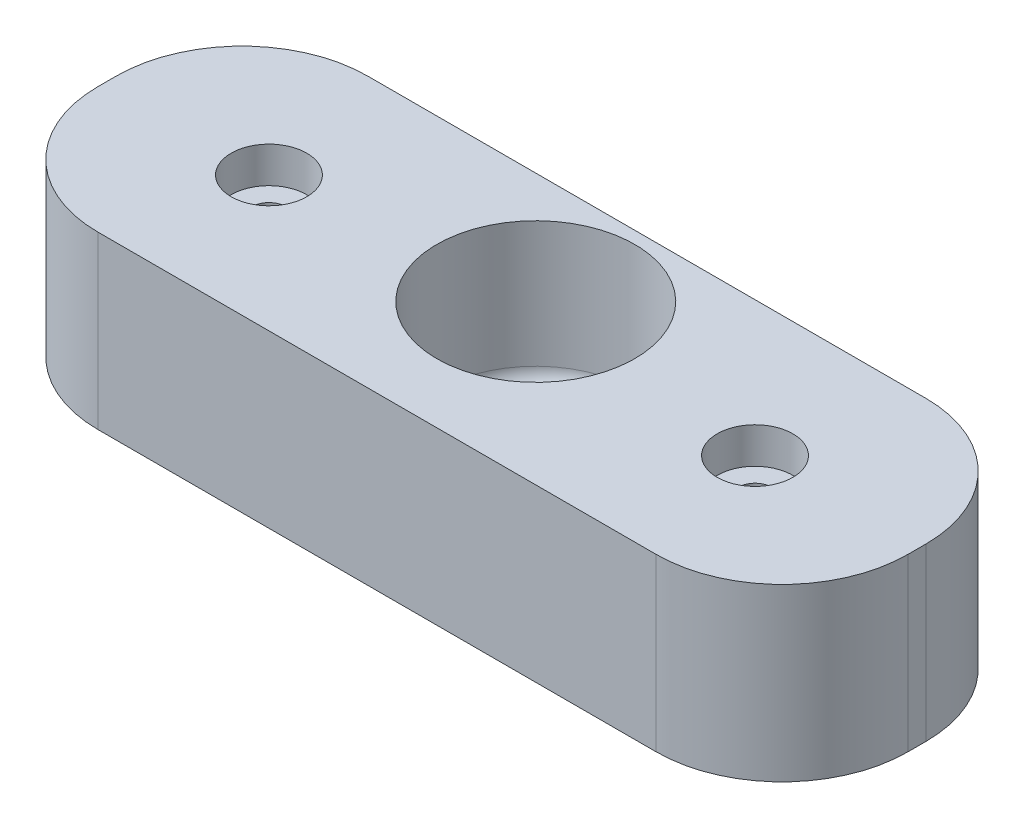
ISO-10303-21;
HEADER;
FILE_DESCRIPTION(('STEP AP214'),'2;1');
FILE_NAME('part.step','',(''),(''),'','','');
FILE_SCHEMA(('AUTOMOTIVE_DESIGN { 1 0 10303 214 1 1 1 1 }'));
ENDSEC;
DATA;
#1=APPLICATION_CONTEXT('core data for automotive mechanical design processes');
#2=APPLICATION_PROTOCOL_DEFINITION('international standard','automotive_design',2000,#1);
#3=PRODUCT_CONTEXT('',#1,'mechanical');
#4=PRODUCT('Part','Part','',(#3));
#5=PRODUCT_RELATED_PRODUCT_CATEGORY('part','',(#4));
#6=PRODUCT_DEFINITION_FORMATION('','',#4);
#7=PRODUCT_DEFINITION_CONTEXT('part definition',#1,'design');
#8=PRODUCT_DEFINITION('design','',#6,#7);
#9=PRODUCT_DEFINITION_SHAPE('','',#8);
#10=(LENGTH_UNIT() NAMED_UNIT(*) SI_UNIT(.MILLI.,.METRE.));
#11=(NAMED_UNIT(*) PLANE_ANGLE_UNIT() SI_UNIT($,.RADIAN.));
#12=(NAMED_UNIT(*) SI_UNIT($,.STERADIAN.) SOLID_ANGLE_UNIT());
#13=UNCERTAINTY_MEASURE_WITH_UNIT(LENGTH_MEASURE(1.E-05),#10,'distance_accuracy_value','');
#14=(GEOMETRIC_REPRESENTATION_CONTEXT(3) GLOBAL_UNCERTAINTY_ASSIGNED_CONTEXT((#13)) GLOBAL_UNIT_ASSIGNED_CONTEXT((#10,
#11,#12)) REPRESENTATION_CONTEXT('',''));
#15=CARTESIAN_POINT('',(0.,0.,0.));
#16=DIRECTION('',(0.,0.,1.));
#17=DIRECTION('',(1.,0.,0.));
#18=AXIS2_PLACEMENT_3D('',#15,#16,#17);
#19=CARTESIAN_POINT('',(0.,-9.5,0.));
#20=DIRECTION('',(-1.,0.,0.));
#21=DIRECTION('',(0.,0.,1.));
#22=AXIS2_PLACEMENT_3D('',#19,#20,#21);
#23=PLANE('',#22);
#24=DIRECTION('',(0.,0.,1.));
#25=VECTOR('',#24,1.);
#26=CARTESIAN_POINT('',(0.,-9.5,0.));
#27=LINE('',#26,#25);
#28=CARTESIAN_POINT('',(0.,-9.5,-8.));
#29=VERTEX_POINT('',#28);
#30=CARTESIAN_POINT('',(0.,-9.5,-7.));
#31=VERTEX_POINT('',#30);
#32=EDGE_CURVE('E247',#29,#31,#27,.T.);
#33=ORIENTED_EDGE('',*,*,#32,.T.);
#34=DIRECTION('',(0.,1.,0.));
#35=VECTOR('',#34,1.);
#36=CARTESIAN_POINT('',(0.,-9.5,-7.));
#37=LINE('',#36,#35);
#38=CARTESIAN_POINT('',(0.,0.,-7.));
#39=VERTEX_POINT('',#38);
#40=EDGE_CURVE('E174',#31,#39,#37,.T.);
#41=ORIENTED_EDGE('',*,*,#40,.T.);
#42=DIRECTION('',(0.,0.,1.));
#43=VECTOR('',#42,1.);
#44=CARTESIAN_POINT('',(0.,0.,0.));
#45=LINE('',#44,#43);
#46=CARTESIAN_POINT('',(0.,0.,-8.));
#47=VERTEX_POINT('',#46);
#48=EDGE_CURVE('E112',#47,#39,#45,.T.);
#49=ORIENTED_EDGE('',*,*,#48,.F.);
#50=DIRECTION('',(0.,1.,0.));
#51=VECTOR('',#50,1.);
#52=CARTESIAN_POINT('',(0.,-9.5,-8.));
#53=LINE('',#52,#51);
#54=EDGE_CURVE('E171',#47,#29,#53,.F.);
#55=ORIENTED_EDGE('',*,*,#54,.T.);
#56=EDGE_LOOP('',(#33,#41,#49,#55));
#57=FACE_BOUND('',#56,.T.);
#58=ADVANCED_FACE('F39',(#57),#23,.T.);
#59=CARTESIAN_POINT('',(0.,-9.5,-15.));
#60=DIRECTION('',(0.,0.,-1.));
#61=DIRECTION('',(-1.,0.,0.));
#62=AXIS2_PLACEMENT_3D('',#59,#60,#61);
#63=PLANE('',#62);
#64=DIRECTION('',(-1.,0.,0.));
#65=VECTOR('',#64,1.);
#66=CARTESIAN_POINT('',(0.,0.,-15.));
#67=LINE('',#66,#65);
#68=CARTESIAN_POINT('',(38.,0.,-15.));
#69=VERTEX_POINT('',#68);
#70=CARTESIAN_POINT('',(7.,0.,-15.));
#71=VERTEX_POINT('',#70);
#72=EDGE_CURVE('E145',#69,#71,#67,.T.);
#73=ORIENTED_EDGE('',*,*,#72,.F.);
#74=DIRECTION('',(0.,1.,0.));
#75=VECTOR('',#74,1.);
#76=CARTESIAN_POINT('',(38.,-9.5,-15.));
#77=LINE('',#76,#75);
#78=CARTESIAN_POINT('',(38.,-9.5,-15.));
#79=VERTEX_POINT('',#78);
#80=EDGE_CURVE('E62',#69,#79,#77,.F.);
#81=ORIENTED_EDGE('',*,*,#80,.T.);
#82=DIRECTION('',(-1.,0.,0.));
#83=VECTOR('',#82,1.);
#84=CARTESIAN_POINT('',(0.,-9.5,-15.));
#85=LINE('',#84,#83);
#86=CARTESIAN_POINT('',(7.,-9.5,-15.));
#87=VERTEX_POINT('',#86);
#88=EDGE_CURVE('E136',#79,#87,#85,.T.);
#89=ORIENTED_EDGE('',*,*,#88,.T.);
#90=DIRECTION('',(0.,1.,0.));
#91=VECTOR('',#90,1.);
#92=CARTESIAN_POINT('',(7.,-9.5,-15.));
#93=LINE('',#92,#91);
#94=EDGE_CURVE('E177',#87,#71,#93,.T.);
#95=ORIENTED_EDGE('',*,*,#94,.T.);
#96=EDGE_LOOP('',(#73,#81,#89,#95));
#97=FACE_BOUND('',#96,.T.);
#98=ADVANCED_FACE('F263',(#97),#63,.T.);
#99=CARTESIAN_POINT('',(45.,-9.5,0.));
#100=DIRECTION('',(1.,0.,0.));
#101=DIRECTION('',(0.,0.,-1.));
#102=AXIS2_PLACEMENT_3D('',#99,#100,#101);
#103=PLANE('',#102);
#104=DIRECTION('',(0.,0.,-1.));
#105=VECTOR('',#104,1.);
#106=CARTESIAN_POINT('',(45.,0.,0.));
#107=LINE('',#106,#105);
#108=CARTESIAN_POINT('',(45.,0.,-7.));
#109=VERTEX_POINT('',#108);
#110=CARTESIAN_POINT('',(45.,0.,-8.));
#111=VERTEX_POINT('',#110);
#112=EDGE_CURVE('E130',#109,#111,#107,.T.);
#113=ORIENTED_EDGE('',*,*,#112,.F.);
#114=DIRECTION('',(0.,1.,0.));
#115=VECTOR('',#114,1.);
#116=CARTESIAN_POINT('',(45.,-9.5,-7.));
#117=LINE('',#116,#115);
#118=CARTESIAN_POINT('',(45.,-9.5,-7.));
#119=VERTEX_POINT('',#118);
#120=EDGE_CURVE('E158',#109,#119,#117,.F.);
#121=ORIENTED_EDGE('',*,*,#120,.T.);
#122=DIRECTION('',(0.,0.,-1.));
#123=VECTOR('',#122,1.);
#124=CARTESIAN_POINT('',(45.,-9.5,0.));
#125=LINE('',#124,#123);
#126=CARTESIAN_POINT('',(45.,-9.5,-8.));
#127=VERTEX_POINT('',#126);
#128=EDGE_CURVE('E142',#119,#127,#125,.T.);
#129=ORIENTED_EDGE('',*,*,#128,.T.);
#130=DIRECTION('',(0.,1.,0.));
#131=VECTOR('',#130,1.);
#132=CARTESIAN_POINT('',(45.,-9.5,-8.));
#133=LINE('',#132,#131);
#134=EDGE_CURVE('E154',#127,#111,#133,.T.);
#135=ORIENTED_EDGE('',*,*,#134,.T.);
#136=EDGE_LOOP('',(#113,#121,#129,#135));
#137=FACE_BOUND('',#136,.T.);
#138=ADVANCED_FACE('F273',(#137),#103,.T.);
#139=CARTESIAN_POINT('',(0.,-9.5,0.));
#140=DIRECTION('',(0.,0.,1.));
#141=DIRECTION('',(1.,0.,0.));
#142=AXIS2_PLACEMENT_3D('',#139,#140,#141);
#143=PLANE('',#142);
#144=DIRECTION('',(1.,0.,0.));
#145=VECTOR('',#144,1.);
#146=CARTESIAN_POINT('',(0.,-9.5,0.));
#147=LINE('',#146,#145);
#148=CARTESIAN_POINT('',(7.,-9.5,0.));
#149=VERTEX_POINT('',#148);
#150=CARTESIAN_POINT('',(38.,-9.5,0.));
#151=VERTEX_POINT('',#150);
#152=EDGE_CURVE('E251',#149,#151,#147,.T.);
#153=ORIENTED_EDGE('',*,*,#152,.T.);
#154=DIRECTION('',(0.,1.,0.));
#155=VECTOR('',#154,1.);
#156=CARTESIAN_POINT('',(38.,-9.5,0.));
#157=LINE('',#156,#155);
#158=CARTESIAN_POINT('',(38.,0.,0.));
#159=VERTEX_POINT('',#158);
#160=EDGE_CURVE('E128',#151,#159,#157,.T.);
#161=ORIENTED_EDGE('',*,*,#160,.T.);
#162=DIRECTION('',(1.,0.,0.));
#163=VECTOR('',#162,1.);
#164=CARTESIAN_POINT('',(0.,0.,0.));
#165=LINE('',#164,#163);
#166=CARTESIAN_POINT('',(7.,0.,0.));
#167=VERTEX_POINT('',#166);
#168=EDGE_CURVE('E110',#167,#159,#165,.T.);
#169=ORIENTED_EDGE('',*,*,#168,.F.);
#170=DIRECTION('',(0.,1.,0.));
#171=VECTOR('',#170,1.);
#172=CARTESIAN_POINT('',(7.,-9.5,0.));
#173=LINE('',#172,#171);
#174=EDGE_CURVE('E125',#167,#149,#173,.F.);
#175=ORIENTED_EDGE('',*,*,#174,.T.);
#176=EDGE_LOOP('',(#153,#161,#169,#175));
#177=FACE_BOUND('',#176,.T.);
#178=ADVANCED_FACE('F124',(#177),#143,.T.);
#179=CARTESIAN_POINT('',(0.,-9.5,0.));
#180=DIRECTION('',(0.,-1.,0.));
#181=DIRECTION('',(0.,0.,-1.));
#182=AXIS2_PLACEMENT_3D('',#179,#180,#181);
#183=PLANE('',#182);
#184=CARTESIAN_POINT('',(36.,-9.5,-7.5));
#185=DIRECTION('',(0.,-1.,0.));
#186=DIRECTION('',(0.,0.,-1.));
#187=AXIS2_PLACEMENT_3D('',#184,#185,#186);
#188=CIRCLE('',#187,2.05);
#189=CARTESIAN_POINT('',(36.,-9.5,-9.55));
#190=VERTEX_POINT('',#189);
#191=EDGE_CURVE('E508',#190,#190,#188,.T.);
#192=ORIENTED_EDGE('',*,*,#191,.F.);
#193=EDGE_LOOP('',(#192));
#194=FACE_BOUND('',#193,.T.);
#195=CARTESIAN_POINT('',(9.,-9.5,-7.50000000000028));
#196=DIRECTION('',(0.,-1.,0.));
#197=DIRECTION('',(0.,0.,-1.));
#198=AXIS2_PLACEMENT_3D('',#195,#196,#197);
#199=CIRCLE('',#198,2.05);
#200=CARTESIAN_POINT('',(9.,-9.5,-9.55000000000028));
#201=VERTEX_POINT('',#200);
#202=EDGE_CURVE('E193',#201,#201,#199,.T.);
#203=ORIENTED_EDGE('',*,*,#202,.F.);
#204=EDGE_LOOP('',(#203));
#205=FACE_BOUND('',#204,.T.);
#206=CARTESIAN_POINT('',(22.5,-9.5,-8.82));
#207=DIRECTION('',(0.,-1.,0.));
#208=DIRECTION('',(0.,0.,-1.));
#209=AXIS2_PLACEMENT_3D('',#206,#207,#208);
#210=CIRCLE('',#209,2.2);
#211=CARTESIAN_POINT('',(22.5,-9.5,-11.02));
#212=VERTEX_POINT('',#211);
#213=EDGE_CURVE('E230',#212,#212,#210,.F.);
#214=ORIENTED_EDGE('',*,*,#213,.T.);
#215=EDGE_LOOP('',(#214));
#216=FACE_BOUND('',#215,.T.);
#217=ORIENTED_EDGE('',*,*,#128,.F.);
#218=CARTESIAN_POINT('',(38.,-9.5,-7.));
#219=DIRECTION('',(0.,-1.,0.));
#220=DIRECTION('',(0.,0.,-1.));
#221=AXIS2_PLACEMENT_3D('',#218,#219,#220);
#222=CIRCLE('',#221,7.);
#223=EDGE_CURVE('E168',#119,#151,#222,.T.);
#224=ORIENTED_EDGE('',*,*,#223,.T.);
#225=ORIENTED_EDGE('',*,*,#152,.F.);
#226=CARTESIAN_POINT('',(7.,-9.5,-7.));
#227=DIRECTION('',(0.,-1.,0.));
#228=DIRECTION('',(0.,0.,-1.));
#229=AXIS2_PLACEMENT_3D('',#226,#227,#228);
#230=CIRCLE('',#229,7.);
#231=EDGE_CURVE('E134',#149,#31,#230,.T.);
#232=ORIENTED_EDGE('',*,*,#231,.T.);
#233=ORIENTED_EDGE('',*,*,#32,.F.);
#234=CARTESIAN_POINT('',(7.,-9.5,-8.));
#235=DIRECTION('',(0.,-1.,0.));
#236=DIRECTION('',(0.,0.,-1.));
#237=AXIS2_PLACEMENT_3D('',#234,#235,#236);
#238=CIRCLE('',#237,7.);
#239=EDGE_CURVE('E55',#29,#87,#238,.T.);
#240=ORIENTED_EDGE('',*,*,#239,.T.);
#241=ORIENTED_EDGE('',*,*,#88,.F.);
#242=CARTESIAN_POINT('',(38.,-9.5,-8.));
#243=DIRECTION('',(0.,-1.,0.));
#244=DIRECTION('',(0.,0.,-1.));
#245=AXIS2_PLACEMENT_3D('',#242,#243,#244);
#246=CIRCLE('',#245,7.);
#247=EDGE_CURVE('E163',#79,#127,#246,.T.);
#248=ORIENTED_EDGE('',*,*,#247,.T.);
#249=EDGE_LOOP('',(#217,#224,#225,#232,#233,#240,#241,#248));
#250=FACE_BOUND('',#249,.T.);
#251=ADVANCED_FACE('F270',(#194,#205,#216,#250),#183,.T.);
#252=CARTESIAN_POINT('',(0.,0.,0.));
#253=DIRECTION('',(0.,-1.,0.));
#254=DIRECTION('',(0.,0.,-1.));
#255=AXIS2_PLACEMENT_3D('',#252,#253,#254);
#256=PLANE('',#255);
#257=CARTESIAN_POINT('',(9.,0.,-7.5));
#258=DIRECTION('',(0.,1.,0.));
#259=DIRECTION('',(0.,0.,1.));
#260=AXIS2_PLACEMENT_3D('',#257,#258,#259);
#261=CIRCLE('',#260,2.1);
#262=CARTESIAN_POINT('',(9.,0.,-5.4));
#263=VERTEX_POINT('',#262);
#264=EDGE_CURVE('E241',#263,#263,#261,.T.);
#265=ORIENTED_EDGE('',*,*,#264,.F.);
#266=EDGE_LOOP('',(#265));
#267=FACE_BOUND('',#266,.T.);
#268=CARTESIAN_POINT('',(36.,0.,-7.5));
#269=DIRECTION('',(0.,1.,0.));
#270=DIRECTION('',(0.,0.,1.));
#271=AXIS2_PLACEMENT_3D('',#268,#269,#270);
#272=CIRCLE('',#271,2.1);
#273=CARTESIAN_POINT('',(36.,0.,-5.4));
#274=VERTEX_POINT('',#273);
#275=EDGE_CURVE('E244',#274,#274,#272,.T.);
#276=ORIENTED_EDGE('',*,*,#275,.F.);
#277=EDGE_LOOP('',(#276));
#278=FACE_BOUND('',#277,.T.);
#279=CARTESIAN_POINT('',(22.5,0.,-8.82));
#280=DIRECTION('',(0.,1.,0.));
#281=DIRECTION('',(0.,0.,1.));
#282=AXIS2_PLACEMENT_3D('',#279,#280,#281);
#283=CIRCLE('',#282,5.5);
#284=CARTESIAN_POINT('',(22.5,0.,-3.32));
#285=VERTEX_POINT('',#284);
#286=EDGE_CURVE('E233',#285,#285,#283,.T.);
#287=ORIENTED_EDGE('',*,*,#286,.F.);
#288=EDGE_LOOP('',(#287));
#289=FACE_BOUND('',#288,.T.);
#290=ORIENTED_EDGE('',*,*,#168,.T.);
#291=CARTESIAN_POINT('',(38.,0.,-7.));
#292=DIRECTION('',(0.,-1.,0.));
#293=DIRECTION('',(0.,0.,-1.));
#294=AXIS2_PLACEMENT_3D('',#291,#292,#293);
#295=CIRCLE('',#294,7.);
#296=EDGE_CURVE('E118',#159,#109,#295,.F.);
#297=ORIENTED_EDGE('',*,*,#296,.T.);
#298=ORIENTED_EDGE('',*,*,#112,.T.);
#299=CARTESIAN_POINT('',(38.,0.,-8.));
#300=DIRECTION('',(0.,-1.,0.));
#301=DIRECTION('',(0.,0.,-1.));
#302=AXIS2_PLACEMENT_3D('',#299,#300,#301);
#303=CIRCLE('',#302,7.);
#304=EDGE_CURVE('E119',#111,#69,#303,.F.);
#305=ORIENTED_EDGE('',*,*,#304,.T.);
#306=ORIENTED_EDGE('',*,*,#72,.T.);
#307=CARTESIAN_POINT('',(7.,0.,-8.));
#308=DIRECTION('',(0.,-1.,0.));
#309=DIRECTION('',(0.,0.,-1.));
#310=AXIS2_PLACEMENT_3D('',#307,#308,#309);
#311=CIRCLE('',#310,7.);
#312=EDGE_CURVE('E140',#71,#47,#311,.F.);
#313=ORIENTED_EDGE('',*,*,#312,.T.);
#314=ORIENTED_EDGE('',*,*,#48,.T.);
#315=CARTESIAN_POINT('',(7.,0.,-7.));
#316=DIRECTION('',(0.,-1.,0.));
#317=DIRECTION('',(0.,0.,-1.));
#318=AXIS2_PLACEMENT_3D('',#315,#316,#317);
#319=CIRCLE('',#318,7.);
#320=EDGE_CURVE('E107',#39,#167,#319,.F.);
#321=ORIENTED_EDGE('',*,*,#320,.T.);
#322=EDGE_LOOP('',(#290,#297,#298,#305,#306,#313,#314,#321));
#323=FACE_BOUND('',#322,.T.);
#324=ADVANCED_FACE('F109',(#267,#278,#289,#323),#256,.F.);
#325=CARTESIAN_POINT('',(22.5,-8.,-8.82));
#326=DIRECTION('',(0.,1.,0.));
#327=DIRECTION('',(0.,0.,1.));
#328=AXIS2_PLACEMENT_3D('',#325,#326,#327);
#329=CYLINDRICAL_SURFACE('',#328,5.5);
#330=CARTESIAN_POINT('',(22.5,-7.,-8.82));
#331=DIRECTION('',(0.,1.,0.));
#332=DIRECTION('',(0.,0.,1.));
#333=AXIS2_PLACEMENT_3D('',#330,#331,#332);
#334=CIRCLE('',#333,5.5);
#335=CARTESIAN_POINT('',(22.5,-7.,-3.32));
#336=VERTEX_POINT('',#335);
#337=EDGE_CURVE('E48',#336,#336,#334,.F.);
#338=ORIENTED_EDGE('',*,*,#337,.T.);
#339=EDGE_LOOP('',(#338));
#340=FACE_BOUND('',#339,.T.);
#341=ORIENTED_EDGE('',*,*,#286,.T.);
#342=EDGE_LOOP('',(#341));
#343=FACE_BOUND('',#342,.T.);
#344=ADVANCED_FACE('F204',(#340,#343),#329,.F.);
#345=CARTESIAN_POINT('',(22.5,-8.,-8.82));
#346=DIRECTION('',(0.,1.,0.));
#347=DIRECTION('',(0.,0.,1.));
#348=AXIS2_PLACEMENT_3D('',#345,#346,#347);
#349=PLANE('',#348);
#350=CARTESIAN_POINT('',(22.5,-8.,-8.82));
#351=DIRECTION('',(0.,1.,0.));
#352=DIRECTION('',(0.,0.,1.));
#353=AXIS2_PLACEMENT_3D('',#350,#351,#352);
#354=CIRCLE('',#353,4.5);
#355=CARTESIAN_POINT('',(22.5,-8.,-4.32));
#356=VERTEX_POINT('',#355);
#357=EDGE_CURVE('E197',#356,#356,#354,.T.);
#358=ORIENTED_EDGE('',*,*,#357,.T.);
#359=EDGE_LOOP('',(#358));
#360=FACE_BOUND('',#359,.T.);
#361=CARTESIAN_POINT('',(22.5,-8.,-8.82));
#362=DIRECTION('',(0.,1.,0.));
#363=DIRECTION('',(0.,0.,1.));
#364=AXIS2_PLACEMENT_3D('',#361,#362,#363);
#365=CIRCLE('',#364,3.2);
#366=CARTESIAN_POINT('',(22.5,-8.,-5.62));
#367=VERTEX_POINT('',#366);
#368=EDGE_CURVE('E183',#367,#367,#365,.F.);
#369=ORIENTED_EDGE('',*,*,#368,.T.);
#370=EDGE_LOOP('',(#369));
#371=FACE_BOUND('',#370,.T.);
#372=ADVANCED_FACE('F213',(#360,#371),#349,.T.);
#373=CARTESIAN_POINT('',(22.5,-9.501,-8.82));
#374=DIRECTION('',(0.,1.,0.));
#375=DIRECTION('',(0.,0.,1.));
#376=AXIS2_PLACEMENT_3D('',#373,#374,#375);
#377=CYLINDRICAL_SURFACE('',#376,2.2);
#378=CARTESIAN_POINT('',(22.5,-9.,-8.82));
#379=DIRECTION('',(0.,1.,0.));
#380=DIRECTION('',(0.,0.,1.));
#381=AXIS2_PLACEMENT_3D('',#378,#379,#380);
#382=CIRCLE('',#381,2.2);
#383=CARTESIAN_POINT('',(22.5,-9.,-6.62));
#384=VERTEX_POINT('',#383);
#385=EDGE_CURVE('E11',#384,#384,#382,.T.);
#386=ORIENTED_EDGE('',*,*,#385,.T.);
#387=EDGE_LOOP('',(#386));
#388=FACE_BOUND('',#387,.T.);
#389=ORIENTED_EDGE('',*,*,#213,.F.);
#390=EDGE_LOOP('',(#389));
#391=FACE_BOUND('',#390,.T.);
#392=ADVANCED_FACE('F216',(#388,#391),#377,.F.);
#393=CARTESIAN_POINT('',(36.,-2.,-7.5));
#394=DIRECTION('',(0.,1.,0.));
#395=DIRECTION('',(0.,0.,1.));
#396=AXIS2_PLACEMENT_3D('',#393,#394,#395);
#397=CYLINDRICAL_SURFACE('',#396,2.1);
#398=CARTESIAN_POINT('',(36.,-2.,-7.5));
#399=DIRECTION('',(0.,1.,0.));
#400=DIRECTION('',(0.,0.,1.));
#401=AXIS2_PLACEMENT_3D('',#398,#399,#400);
#402=CIRCLE('',#401,2.1);
#403=CARTESIAN_POINT('',(36.,-2.,-5.4));
#404=VERTEX_POINT('',#403);
#405=EDGE_CURVE('E502',#404,#404,#402,.T.);
#406=ORIENTED_EDGE('',*,*,#405,.F.);
#407=EDGE_LOOP('',(#406));
#408=FACE_BOUND('',#407,.T.);
#409=ORIENTED_EDGE('',*,*,#275,.T.);
#410=EDGE_LOOP('',(#409));
#411=FACE_BOUND('',#410,.T.);
#412=ADVANCED_FACE('F226',(#408,#411),#397,.F.);
#413=CARTESIAN_POINT('',(36.,-2.,-7.5));
#414=DIRECTION('',(0.,1.,0.));
#415=DIRECTION('',(0.,0.,1.));
#416=AXIS2_PLACEMENT_3D('',#413,#414,#415);
#417=PLANE('',#416);
#418=CARTESIAN_POINT('',(36.,-2.,-7.5));
#419=DIRECTION('',(0.,1.,0.));
#420=DIRECTION('',(0.,0.,1.));
#421=AXIS2_PLACEMENT_3D('',#418,#419,#420);
#422=CIRCLE('',#421,0.950000000000001);
#423=CARTESIAN_POINT('',(36.,-2.,-6.55));
#424=VERTEX_POINT('',#423);
#425=EDGE_CURVE('E517',#424,#424,#422,.T.);
#426=ORIENTED_EDGE('',*,*,#425,.F.);
#427=EDGE_LOOP('',(#426));
#428=FACE_BOUND('',#427,.T.);
#429=ORIENTED_EDGE('',*,*,#405,.T.);
#430=EDGE_LOOP('',(#429));
#431=FACE_BOUND('',#430,.T.);
#432=ADVANCED_FACE('F357',(#428,#431),#417,.T.);
#433=CARTESIAN_POINT('',(9.,-2.,-7.5));
#434=DIRECTION('',(0.,1.,0.));
#435=DIRECTION('',(0.,0.,1.));
#436=AXIS2_PLACEMENT_3D('',#433,#434,#435);
#437=CYLINDRICAL_SURFACE('',#436,2.1);
#438=CARTESIAN_POINT('',(9.,-2.,-7.5));
#439=DIRECTION('',(0.,1.,0.));
#440=DIRECTION('',(0.,0.,1.));
#441=AXIS2_PLACEMENT_3D('',#438,#439,#440);
#442=CIRCLE('',#441,2.1);
#443=CARTESIAN_POINT('',(9.,-2.,-5.4));
#444=VERTEX_POINT('',#443);
#445=EDGE_CURVE('E234',#444,#444,#442,.T.);
#446=ORIENTED_EDGE('',*,*,#445,.F.);
#447=EDGE_LOOP('',(#446));
#448=FACE_BOUND('',#447,.T.);
#449=ORIENTED_EDGE('',*,*,#264,.T.);
#450=EDGE_LOOP('',(#449));
#451=FACE_BOUND('',#450,.T.);
#452=ADVANCED_FACE('F362',(#448,#451),#437,.F.);
#453=CARTESIAN_POINT('',(9.,-2.,-7.5));
#454=DIRECTION('',(0.,1.,0.));
#455=DIRECTION('',(0.,0.,1.));
#456=AXIS2_PLACEMENT_3D('',#453,#454,#455);
#457=PLANE('',#456);
#458=CARTESIAN_POINT('',(9.,-2.,-7.5));
#459=DIRECTION('',(0.,1.,0.));
#460=DIRECTION('',(0.,0.,1.));
#461=AXIS2_PLACEMENT_3D('',#458,#459,#460);
#462=CIRCLE('',#461,0.949999999999999);
#463=CARTESIAN_POINT('',(9.,-2.,-6.55));
#464=VERTEX_POINT('',#463);
#465=EDGE_CURVE('E189',#464,#464,#462,.T.);
#466=ORIENTED_EDGE('',*,*,#465,.F.);
#467=EDGE_LOOP('',(#466));
#468=FACE_BOUND('',#467,.T.);
#469=ORIENTED_EDGE('',*,*,#445,.T.);
#470=EDGE_LOOP('',(#469));
#471=FACE_BOUND('',#470,.T.);
#472=ADVANCED_FACE('F303',(#468,#471),#457,.T.);
#473=CARTESIAN_POINT('',(38.,-9.5,-7.));
#474=DIRECTION('',(0.,1.,0.));
#475=DIRECTION('',(0.,0.,1.));
#476=AXIS2_PLACEMENT_3D('',#473,#474,#475);
#477=CYLINDRICAL_SURFACE('',#476,7.);
#478=ORIENTED_EDGE('',*,*,#223,.F.);
#479=ORIENTED_EDGE('',*,*,#120,.F.);
#480=ORIENTED_EDGE('',*,*,#296,.F.);
#481=ORIENTED_EDGE('',*,*,#160,.F.);
#482=EDGE_LOOP('',(#478,#479,#480,#481));
#483=FACE_BOUND('',#482,.T.);
#484=ADVANCED_FACE('F276',(#483),#477,.T.);
#485=CARTESIAN_POINT('',(7.,-9.5,-7.));
#486=DIRECTION('',(0.,1.,0.));
#487=DIRECTION('',(0.,0.,1.));
#488=AXIS2_PLACEMENT_3D('',#485,#486,#487);
#489=CYLINDRICAL_SURFACE('',#488,7.);
#490=ORIENTED_EDGE('',*,*,#231,.F.);
#491=ORIENTED_EDGE('',*,*,#174,.F.);
#492=ORIENTED_EDGE('',*,*,#320,.F.);
#493=ORIENTED_EDGE('',*,*,#40,.F.);
#494=EDGE_LOOP('',(#490,#491,#492,#493));
#495=FACE_BOUND('',#494,.T.);
#496=ADVANCED_FACE('F133',(#495),#489,.T.);
#497=CARTESIAN_POINT('',(38.,-9.5,-8.));
#498=DIRECTION('',(0.,1.,0.));
#499=DIRECTION('',(0.,0.,1.));
#500=AXIS2_PLACEMENT_3D('',#497,#498,#499);
#501=CYLINDRICAL_SURFACE('',#500,7.);
#502=ORIENTED_EDGE('',*,*,#247,.F.);
#503=ORIENTED_EDGE('',*,*,#80,.F.);
#504=ORIENTED_EDGE('',*,*,#304,.F.);
#505=ORIENTED_EDGE('',*,*,#134,.F.);
#506=EDGE_LOOP('',(#502,#503,#504,#505));
#507=FACE_BOUND('',#506,.T.);
#508=ADVANCED_FACE('F267',(#507),#501,.T.);
#509=CARTESIAN_POINT('',(7.,-9.5,-8.));
#510=DIRECTION('',(0.,1.,0.));
#511=DIRECTION('',(0.,0.,1.));
#512=AXIS2_PLACEMENT_3D('',#509,#510,#511);
#513=CYLINDRICAL_SURFACE('',#512,7.);
#514=ORIENTED_EDGE('',*,*,#239,.F.);
#515=ORIENTED_EDGE('',*,*,#54,.F.);
#516=ORIENTED_EDGE('',*,*,#312,.F.);
#517=ORIENTED_EDGE('',*,*,#94,.F.);
#518=EDGE_LOOP('',(#514,#515,#516,#517));
#519=FACE_BOUND('',#518,.T.);
#520=ADVANCED_FACE('F280',(#519),#513,.T.);
#521=CARTESIAN_POINT('',(9.,-4.5,-7.50000000000028));
#522=DIRECTION('',(0.,-1.,0.));
#523=DIRECTION('',(0.,0.,-1.));
#524=AXIS2_PLACEMENT_3D('',#521,#522,#523);
#525=CYLINDRICAL_SURFACE('',#524,2.05);
#526=CARTESIAN_POINT('',(9.,-4.5,-7.50000000000028));
#527=DIRECTION('',(0.,-1.,0.));
#528=DIRECTION('',(0.,0.,-1.));
#529=AXIS2_PLACEMENT_3D('',#526,#527,#528);
#530=CIRCLE('',#529,2.05);
#531=CARTESIAN_POINT('',(9.,-4.5,-9.55000000000028));
#532=VERTEX_POINT('',#531);
#533=EDGE_CURVE('E514',#532,#532,#530,.T.);
#534=ORIENTED_EDGE('',*,*,#533,.F.);
#535=EDGE_LOOP('',(#534));
#536=FACE_BOUND('',#535,.T.);
#537=ORIENTED_EDGE('',*,*,#202,.T.);
#538=EDGE_LOOP('',(#537));
#539=FACE_BOUND('',#538,.T.);
#540=ADVANCED_FACE('F282',(#536,#539),#525,.F.);
#541=CARTESIAN_POINT('',(9.,-4.5,-7.50000000000028));
#542=DIRECTION('',(0.,-1.,0.));
#543=DIRECTION('',(0.,0.,-1.));
#544=AXIS2_PLACEMENT_3D('',#541,#542,#543);
#545=PLANE('',#544);
#546=CARTESIAN_POINT('',(9.,-4.5,-7.5));
#547=DIRECTION('',(0.,-1.,0.));
#548=DIRECTION('',(0.,0.,-1.));
#549=AXIS2_PLACEMENT_3D('',#546,#547,#548);
#550=CIRCLE('',#549,0.949999999999999);
#551=CARTESIAN_POINT('',(9.,-4.5,-8.45));
#552=VERTEX_POINT('',#551);
#553=EDGE_CURVE('E188',#552,#552,#550,.T.);
#554=ORIENTED_EDGE('',*,*,#553,.F.);
#555=EDGE_LOOP('',(#554));
#556=FACE_BOUND('',#555,.T.);
#557=ORIENTED_EDGE('',*,*,#533,.T.);
#558=EDGE_LOOP('',(#557));
#559=FACE_BOUND('',#558,.T.);
#560=ADVANCED_FACE('F288',(#556,#559),#545,.T.);
#561=CARTESIAN_POINT('',(36.,-4.5,-7.5));
#562=DIRECTION('',(0.,-1.,0.));
#563=DIRECTION('',(0.,0.,-1.));
#564=AXIS2_PLACEMENT_3D('',#561,#562,#563);
#565=CYLINDRICAL_SURFACE('',#564,2.05);
#566=CARTESIAN_POINT('',(36.,-4.5,-7.5));
#567=DIRECTION('',(0.,-1.,0.));
#568=DIRECTION('',(0.,0.,-1.));
#569=AXIS2_PLACEMENT_3D('',#566,#567,#568);
#570=CIRCLE('',#569,2.05);
#571=CARTESIAN_POINT('',(36.,-4.5,-9.55));
#572=VERTEX_POINT('',#571);
#573=EDGE_CURVE('E503',#572,#572,#570,.T.);
#574=ORIENTED_EDGE('',*,*,#573,.F.);
#575=EDGE_LOOP('',(#574));
#576=FACE_BOUND('',#575,.T.);
#577=ORIENTED_EDGE('',*,*,#191,.T.);
#578=EDGE_LOOP('',(#577));
#579=FACE_BOUND('',#578,.T.);
#580=ADVANCED_FACE('F344',(#576,#579),#565,.F.);
#581=CARTESIAN_POINT('',(36.,-4.5,-7.5));
#582=DIRECTION('',(0.,-1.,0.));
#583=DIRECTION('',(0.,0.,-1.));
#584=AXIS2_PLACEMENT_3D('',#581,#582,#583);
#585=PLANE('',#584);
#586=CARTESIAN_POINT('',(36.,-4.5,-7.5));
#587=DIRECTION('',(0.,-1.,0.));
#588=DIRECTION('',(0.,0.,-1.));
#589=AXIS2_PLACEMENT_3D('',#586,#587,#588);
#590=CIRCLE('',#589,0.950000000000001);
#591=CARTESIAN_POINT('',(36.,-4.5,-8.45));
#592=VERTEX_POINT('',#591);
#593=EDGE_CURVE('E184',#592,#592,#590,.T.);
#594=ORIENTED_EDGE('',*,*,#593,.F.);
#595=EDGE_LOOP('',(#594));
#596=FACE_BOUND('',#595,.T.);
#597=ORIENTED_EDGE('',*,*,#573,.T.);
#598=EDGE_LOOP('',(#597));
#599=FACE_BOUND('',#598,.T.);
#600=ADVANCED_FACE('F349',(#596,#599),#585,.T.);
#601=CARTESIAN_POINT('',(36.,-5.,-7.5));
#602=DIRECTION('',(0.,1.,0.));
#603=DIRECTION('',(0.,0.,1.));
#604=AXIS2_PLACEMENT_3D('',#601,#602,#603);
#605=CYLINDRICAL_SURFACE('',#604,0.950000000000001);
#606=ORIENTED_EDGE('',*,*,#593,.T.);
#607=EDGE_LOOP('',(#606));
#608=FACE_BOUND('',#607,.T.);
#609=ORIENTED_EDGE('',*,*,#425,.T.);
#610=EDGE_LOOP('',(#609));
#611=FACE_BOUND('',#610,.T.);
#612=ADVANCED_FACE('F390',(#608,#611),#605,.F.);
#613=CARTESIAN_POINT('',(9.,-5.,-7.5));
#614=DIRECTION('',(0.,1.,0.));
#615=DIRECTION('',(0.,0.,1.));
#616=AXIS2_PLACEMENT_3D('',#613,#614,#615);
#617=CYLINDRICAL_SURFACE('',#616,0.949999999999999);
#618=ORIENTED_EDGE('',*,*,#553,.T.);
#619=EDGE_LOOP('',(#618));
#620=FACE_BOUND('',#619,.T.);
#621=ORIENTED_EDGE('',*,*,#465,.T.);
#622=EDGE_LOOP('',(#621));
#623=FACE_BOUND('',#622,.T.);
#624=ADVANCED_FACE('F210',(#620,#623),#617,.F.);
#625=CARTESIAN_POINT('',(22.5,-7.,-8.82));
#626=DIRECTION('',(0.,1.,0.));
#627=DIRECTION('',(0.,0.,1.));
#628=AXIS2_PLACEMENT_3D('',#625,#626,#627);
#629=TOROIDAL_SURFACE('',#628,4.5,1.);
#630=ORIENTED_EDGE('',*,*,#337,.F.);
#631=EDGE_LOOP('',(#630));
#632=FACE_BOUND('',#631,.T.);
#633=ORIENTED_EDGE('',*,*,#357,.F.);
#634=EDGE_LOOP('',(#633));
#635=FACE_BOUND('',#634,.T.);
#636=ADVANCED_FACE('F207',(#632,#635),#629,.F.);
#637=CARTESIAN_POINT('',(22.5,-9.,-8.82));
#638=DIRECTION('',(0.,1.,0.));
#639=DIRECTION('',(0.,0.,1.));
#640=AXIS2_PLACEMENT_3D('',#637,#638,#639);
#641=TOROIDAL_SURFACE('',#640,3.2,1.);
#642=ORIENTED_EDGE('',*,*,#368,.F.);
#643=EDGE_LOOP('',(#642));
#644=FACE_BOUND('',#643,.T.);
#645=ORIENTED_EDGE('',*,*,#385,.F.);
#646=EDGE_LOOP('',(#645));
#647=FACE_BOUND('',#646,.T.);
#648=ADVANCED_FACE('F41',(#644,#647),#641,.T.);
#649=CLOSED_SHELL('',(#58,#98,#138,#178,#251,#324,#344,#372,#392,#412,#432,#452,#472,#484,#496,
#508,#520,#540,#560,#580,#600,#612,#624,#636,#648));
#650=MANIFOLD_SOLID_BREP('B2',#649);
#651=ADVANCED_BREP_SHAPE_REPRESENTATION('',(#18,#650),#14);
#652=SHAPE_DEFINITION_REPRESENTATION(#9,#651);
ENDSEC;
END-ISO-10303-21;
